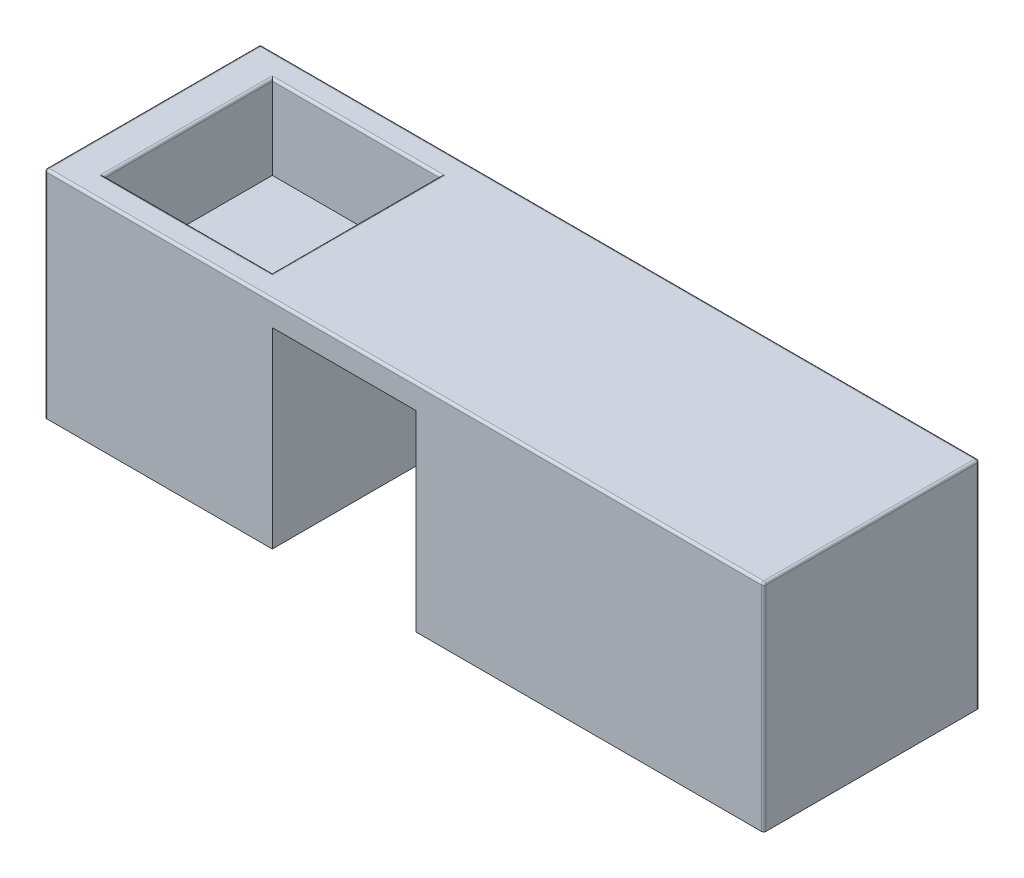
ISO-10303-21;
HEADER;
FILE_DESCRIPTION(('STEP AP214'),'2;1');
FILE_NAME('part.step','',(''),(''),'','','');
FILE_SCHEMA(('AUTOMOTIVE_DESIGN { 1 0 10303 214 1 1 1 1 }'));
ENDSEC;
DATA;
#1=APPLICATION_CONTEXT('core data for automotive mechanical design processes');
#2=APPLICATION_PROTOCOL_DEFINITION('international standard','automotive_design',2000,#1);
#3=PRODUCT_CONTEXT('',#1,'mechanical');
#4=PRODUCT('Part','Part','',(#3));
#5=PRODUCT_RELATED_PRODUCT_CATEGORY('part','',(#4));
#6=PRODUCT_DEFINITION_FORMATION('','',#4);
#7=PRODUCT_DEFINITION_CONTEXT('part definition',#1,'design');
#8=PRODUCT_DEFINITION('design','',#6,#7);
#9=PRODUCT_DEFINITION_SHAPE('','',#8);
#10=(LENGTH_UNIT() NAMED_UNIT(*) SI_UNIT(.MILLI.,.METRE.));
#11=(NAMED_UNIT(*) PLANE_ANGLE_UNIT() SI_UNIT($,.RADIAN.));
#12=(NAMED_UNIT(*) SI_UNIT($,.STERADIAN.) SOLID_ANGLE_UNIT());
#13=UNCERTAINTY_MEASURE_WITH_UNIT(LENGTH_MEASURE(1.E-05),#10,'distance_accuracy_value','');
#14=(GEOMETRIC_REPRESENTATION_CONTEXT(3) GLOBAL_UNCERTAINTY_ASSIGNED_CONTEXT((#13)) GLOBAL_UNIT_ASSIGNED_CONTEXT((#10,
#11,#12)) REPRESENTATION_CONTEXT('',''));
#15=CARTESIAN_POINT('',(0.,0.,0.));
#16=DIRECTION('',(0.,0.,1.));
#17=DIRECTION('',(1.,0.,0.));
#18=AXIS2_PLACEMENT_3D('',#15,#16,#17);
#19=CARTESIAN_POINT('',(-1500.,900.,450.));
#20=DIRECTION('',(0.,0.,-1.));
#21=DIRECTION('',(-1.,0.,0.));
#22=AXIS2_PLACEMENT_3D('',#19,#20,#21);
#23=PLANE('',#22);
#24=DIRECTION('',(1.,0.,0.));
#25=VECTOR('',#24,1.);
#26=CARTESIAN_POINT('',(-1500.,0.,450.));
#27=LINE('',#26,#25);
#28=CARTESIAN_POINT('',(50.0000000000007,0.,450.));
#29=VERTEX_POINT('',#28);
#30=CARTESIAN_POINT('',(1490.,0.,450.));
#31=VERTEX_POINT('',#30);
#32=EDGE_CURVE('E254',#29,#31,#27,.T.);
#33=ORIENTED_EDGE('',*,*,#32,.T.);
#34=DIRECTION('',(0.,-1.,0.));
#35=VECTOR('',#34,1.);
#36=CARTESIAN_POINT('',(1490.,900.,450.));
#37=LINE('',#36,#35);
#38=CARTESIAN_POINT('',(1490.,890.,450.));
#39=VERTEX_POINT('',#38);
#40=EDGE_CURVE('E340',#31,#39,#37,.F.);
#41=ORIENTED_EDGE('',*,*,#40,.T.);
#42=DIRECTION('',(1.,0.,0.));
#43=VECTOR('',#42,1.);
#44=CARTESIAN_POINT('',(-1500.,890.,450.));
#45=LINE('',#44,#43);
#46=CARTESIAN_POINT('',(-1490.,890.,450.));
#47=VERTEX_POINT('',#46);
#48=EDGE_CURVE('E278',#39,#47,#45,.F.);
#49=ORIENTED_EDGE('',*,*,#48,.T.);
#50=DIRECTION('',(0.,-1.,0.));
#51=VECTOR('',#50,1.);
#52=CARTESIAN_POINT('',(-1490.,900.,450.));
#53=LINE('',#52,#51);
#54=CARTESIAN_POINT('',(-1490.,0.,450.));
#55=VERTEX_POINT('',#54);
#56=EDGE_CURVE('E338',#47,#55,#53,.T.);
#57=ORIENTED_EDGE('',*,*,#56,.T.);
#58=CARTESIAN_POINT('',(-550.,0.,450.));
#59=VERTEX_POINT('',#58);
#60=EDGE_CURVE('E255',#55,#59,#27,.T.);
#61=ORIENTED_EDGE('',*,*,#60,.T.);
#62=DIRECTION('',(0.,-1.,0.));
#63=VECTOR('',#62,1.);
#64=CARTESIAN_POINT('',(-550.,800.,450.));
#65=LINE('',#64,#63);
#66=CARTESIAN_POINT('',(-550.,800.,450.));
#67=VERTEX_POINT('',#66);
#68=EDGE_CURVE('E223',#67,#59,#65,.T.);
#69=ORIENTED_EDGE('',*,*,#68,.F.);
#70=DIRECTION('',(-1.,0.,0.));
#71=VECTOR('',#70,1.);
#72=CARTESIAN_POINT('',(50.0000000000006,800.,450.));
#73=LINE('',#72,#71);
#74=CARTESIAN_POINT('',(50.0000000000007,800.,450.));
#75=VERTEX_POINT('',#74);
#76=EDGE_CURVE('E229',#75,#67,#73,.T.);
#77=ORIENTED_EDGE('',*,*,#76,.F.);
#78=DIRECTION('',(0.,1.,0.));
#79=VECTOR('',#78,1.);
#80=CARTESIAN_POINT('',(50.0000000000006,800.,450.));
#81=LINE('',#80,#79);
#82=EDGE_CURVE('E226',#29,#75,#81,.T.);
#83=ORIENTED_EDGE('',*,*,#82,.F.);
#84=EDGE_LOOP('',(#33,#41,#49,#57,#61,#69,#77,#83));
#85=FACE_BOUND('',#84,.T.);
#86=ADVANCED_FACE('F35',(#85),#23,.F.);
#87=CARTESIAN_POINT('',(0.,0.,0.));
#88=DIRECTION('',(0.,-1.,0.));
#89=DIRECTION('',(0.,0.,-1.));
#90=AXIS2_PLACEMENT_3D('',#87,#88,#89);
#91=PLANE('',#90);
#92=DIRECTION('',(-1.,0.,0.));
#93=VECTOR('',#92,1.);
#94=CARTESIAN_POINT('',(-1500.,0.,-450.));
#95=LINE('',#94,#93);
#96=CARTESIAN_POINT('',(1490.,0.,-450.));
#97=VERTEX_POINT('',#96);
#98=CARTESIAN_POINT('',(-1490.,0.,-450.));
#99=VERTEX_POINT('',#98);
#100=EDGE_CURVE('E248',#97,#99,#95,.T.);
#101=ORIENTED_EDGE('',*,*,#100,.F.);
#102=CARTESIAN_POINT('',(1490.,0.,-440.));
#103=DIRECTION('',(0.,-1.,0.));
#104=DIRECTION('',(0.,0.,-1.));
#105=AXIS2_PLACEMENT_3D('',#102,#103,#104);
#106=CIRCLE('',#105,10.);
#107=CARTESIAN_POINT('',(1500.,0.,-440.));
#108=VERTEX_POINT('',#107);
#109=EDGE_CURVE('E52',#97,#108,#106,.T.);
#110=ORIENTED_EDGE('',*,*,#109,.T.);
#111=DIRECTION('',(0.,0.,-1.));
#112=VECTOR('',#111,1.);
#113=CARTESIAN_POINT('',(1500.,0.,450.));
#114=LINE('',#113,#112);
#115=CARTESIAN_POINT('',(1500.,0.,440.));
#116=VERTEX_POINT('',#115);
#117=EDGE_CURVE('E244',#116,#108,#114,.T.);
#118=ORIENTED_EDGE('',*,*,#117,.F.);
#119=CARTESIAN_POINT('',(1490.,0.,440.));
#120=DIRECTION('',(0.,-1.,0.));
#121=DIRECTION('',(0.,0.,-1.));
#122=AXIS2_PLACEMENT_3D('',#119,#120,#121);
#123=CIRCLE('',#122,10.);
#124=EDGE_CURVE('E332',#116,#31,#123,.T.);
#125=ORIENTED_EDGE('',*,*,#124,.T.);
#126=ORIENTED_EDGE('',*,*,#32,.F.);
#127=DIRECTION('',(0.,0.,-1.));
#128=VECTOR('',#127,1.);
#129=CARTESIAN_POINT('',(50.0000000000006,0.,5648.54268420008));
#130=LINE('',#129,#128);
#131=CARTESIAN_POINT('',(50.0000000000007,0.,-350.));
#132=VERTEX_POINT('',#131);
#133=EDGE_CURVE('E239',#29,#132,#130,.T.);
#134=ORIENTED_EDGE('',*,*,#133,.T.);
#135=DIRECTION('',(1.,0.,0.));
#136=VECTOR('',#135,1.);
#137=CARTESIAN_POINT('',(-1500.,0.,-350.));
#138=LINE('',#137,#136);
#139=CARTESIAN_POINT('',(-550.,0.,-350.));
#140=VERTEX_POINT('',#139);
#141=EDGE_CURVE('E210',#140,#132,#138,.T.);
#142=ORIENTED_EDGE('',*,*,#141,.F.);
#143=DIRECTION('',(0.,0.,-1.));
#144=VECTOR('',#143,1.);
#145=CARTESIAN_POINT('',(-550.,0.,5648.54268420008));
#146=LINE('',#145,#144);
#147=EDGE_CURVE('E218',#59,#140,#146,.T.);
#148=ORIENTED_EDGE('',*,*,#147,.F.);
#149=ORIENTED_EDGE('',*,*,#60,.F.);
#150=CARTESIAN_POINT('',(-1490.,0.,440.));
#151=DIRECTION('',(0.,-1.,0.));
#152=DIRECTION('',(0.,0.,-1.));
#153=AXIS2_PLACEMENT_3D('',#150,#151,#152);
#154=CIRCLE('',#153,10.);
#155=CARTESIAN_POINT('',(-1500.,0.,440.));
#156=VERTEX_POINT('',#155);
#157=EDGE_CURVE('E328',#55,#156,#154,.T.);
#158=ORIENTED_EDGE('',*,*,#157,.T.);
#159=DIRECTION('',(0.,0.,1.));
#160=VECTOR('',#159,1.);
#161=CARTESIAN_POINT('',(-1500.,0.,450.));
#162=LINE('',#161,#160);
#163=CARTESIAN_POINT('',(-1500.,0.,-440.));
#164=VERTEX_POINT('',#163);
#165=EDGE_CURVE('E251',#164,#156,#162,.T.);
#166=ORIENTED_EDGE('',*,*,#165,.F.);
#167=CARTESIAN_POINT('',(-1490.,0.,-440.));
#168=DIRECTION('',(0.,-1.,0.));
#169=DIRECTION('',(0.,0.,-1.));
#170=AXIS2_PLACEMENT_3D('',#167,#168,#169);
#171=CIRCLE('',#170,10.);
#172=EDGE_CURVE('E330',#164,#99,#171,.T.);
#173=ORIENTED_EDGE('',*,*,#172,.T.);
#174=EDGE_LOOP('',(#101,#110,#118,#125,#126,#134,#142,#148,#149,#158,#166,#173));
#175=FACE_BOUND('',#174,.T.);
#176=ADVANCED_FACE('F401',(#175),#91,.T.);
#177=CARTESIAN_POINT('',(1500.,900.,450.));
#178=DIRECTION('',(-1.,0.,0.));
#179=DIRECTION('',(0.,0.,1.));
#180=AXIS2_PLACEMENT_3D('',#177,#178,#179);
#181=PLANE('',#180);
#182=ORIENTED_EDGE('',*,*,#117,.T.);
#183=DIRECTION('',(0.,-1.,0.));
#184=VECTOR('',#183,1.);
#185=CARTESIAN_POINT('',(1500.,900.,-440.));
#186=LINE('',#185,#184);
#187=CARTESIAN_POINT('',(1500.,890.,-440.));
#188=VERTEX_POINT('',#187);
#189=EDGE_CURVE('E336',#108,#188,#186,.F.);
#190=ORIENTED_EDGE('',*,*,#189,.T.);
#191=DIRECTION('',(0.,0.,-1.));
#192=VECTOR('',#191,1.);
#193=CARTESIAN_POINT('',(1500.,890.,450.));
#194=LINE('',#193,#192);
#195=CARTESIAN_POINT('',(1500.,890.,440.));
#196=VERTEX_POINT('',#195);
#197=EDGE_CURVE('E287',#188,#196,#194,.F.);
#198=ORIENTED_EDGE('',*,*,#197,.T.);
#199=DIRECTION('',(0.,-1.,0.));
#200=VECTOR('',#199,1.);
#201=CARTESIAN_POINT('',(1500.,900.,440.));
#202=LINE('',#201,#200);
#203=EDGE_CURVE('E59',#196,#116,#202,.T.);
#204=ORIENTED_EDGE('',*,*,#203,.T.);
#205=EDGE_LOOP('',(#182,#190,#198,#204));
#206=FACE_BOUND('',#205,.T.);
#207=ADVANCED_FACE('F414',(#206),#181,.F.);
#208=CARTESIAN_POINT('',(-1500.,900.,-450.));
#209=DIRECTION('',(0.,0.,1.));
#210=DIRECTION('',(1.,0.,0.));
#211=AXIS2_PLACEMENT_3D('',#208,#209,#210);
#212=PLANE('',#211);
#213=DIRECTION('',(-1.,0.,0.));
#214=VECTOR('',#213,1.);
#215=CARTESIAN_POINT('',(-1500.,890.,-450.));
#216=LINE('',#215,#214);
#217=CARTESIAN_POINT('',(-1490.,890.,-450.));
#218=VERTEX_POINT('',#217);
#219=CARTESIAN_POINT('',(1490.,890.,-450.));
#220=VERTEX_POINT('',#219);
#221=EDGE_CURVE('E284',#218,#220,#216,.F.);
#222=ORIENTED_EDGE('',*,*,#221,.T.);
#223=DIRECTION('',(0.,-1.,0.));
#224=VECTOR('',#223,1.);
#225=CARTESIAN_POINT('',(1490.,900.,-450.));
#226=LINE('',#225,#224);
#227=EDGE_CURVE('E326',#220,#97,#226,.T.);
#228=ORIENTED_EDGE('',*,*,#227,.T.);
#229=ORIENTED_EDGE('',*,*,#100,.T.);
#230=DIRECTION('',(0.,-1.,0.));
#231=VECTOR('',#230,1.);
#232=CARTESIAN_POINT('',(-1490.,900.,-450.));
#233=LINE('',#232,#231);
#234=EDGE_CURVE('E324',#99,#218,#233,.F.);
#235=ORIENTED_EDGE('',*,*,#234,.T.);
#236=EDGE_LOOP('',(#222,#228,#229,#235));
#237=FACE_BOUND('',#236,.T.);
#238=ADVANCED_FACE('F423',(#237),#212,.F.);
#239=CARTESIAN_POINT('',(-1500.,900.,450.));
#240=DIRECTION('',(1.,0.,0.));
#241=DIRECTION('',(0.,0.,-1.));
#242=AXIS2_PLACEMENT_3D('',#239,#240,#241);
#243=PLANE('',#242);
#244=DIRECTION('',(0.,0.,1.));
#245=VECTOR('',#244,1.);
#246=CARTESIAN_POINT('',(-1500.,890.,450.));
#247=LINE('',#246,#245);
#248=CARTESIAN_POINT('',(-1500.,890.,440.));
#249=VERTEX_POINT('',#248);
#250=CARTESIAN_POINT('',(-1500.,890.,-440.));
#251=VERTEX_POINT('',#250);
#252=EDGE_CURVE('E281',#249,#251,#247,.F.);
#253=ORIENTED_EDGE('',*,*,#252,.T.);
#254=DIRECTION('',(0.,-1.,0.));
#255=VECTOR('',#254,1.);
#256=CARTESIAN_POINT('',(-1500.,900.,-440.));
#257=LINE('',#256,#255);
#258=EDGE_CURVE('E11',#251,#164,#257,.T.);
#259=ORIENTED_EDGE('',*,*,#258,.T.);
#260=ORIENTED_EDGE('',*,*,#165,.T.);
#261=DIRECTION('',(0.,-1.,0.));
#262=VECTOR('',#261,1.);
#263=CARTESIAN_POINT('',(-1500.,900.,440.));
#264=LINE('',#263,#262);
#265=EDGE_CURVE('E44',#156,#249,#264,.F.);
#266=ORIENTED_EDGE('',*,*,#265,.T.);
#267=EDGE_LOOP('',(#253,#259,#260,#266));
#268=FACE_BOUND('',#267,.T.);
#269=ADVANCED_FACE('F400',(#268),#243,.F.);
#270=CARTESIAN_POINT('',(0.,900.,0.));
#271=DIRECTION('',(0.,-1.,0.));
#272=DIRECTION('',(0.,0.,-1.));
#273=AXIS2_PLACEMENT_3D('',#270,#271,#272);
#274=PLANE('',#273);
#275=DIRECTION('',(0.,0.,1.));
#276=VECTOR('',#275,1.);
#277=CARTESIAN_POINT('',(-1490.,900.,0.));
#278=LINE('',#277,#276);
#279=CARTESIAN_POINT('',(-1490.,900.,-440.));
#280=VERTEX_POINT('',#279);
#281=CARTESIAN_POINT('',(-1490.,900.,440.));
#282=VERTEX_POINT('',#281);
#283=EDGE_CURVE('E272',#280,#282,#278,.T.);
#284=ORIENTED_EDGE('',*,*,#283,.T.);
#285=DIRECTION('',(1.,0.,0.));
#286=VECTOR('',#285,1.);
#287=CARTESIAN_POINT('',(0.,900.,440.));
#288=LINE('',#287,#286);
#289=CARTESIAN_POINT('',(1490.,900.,440.));
#290=VERTEX_POINT('',#289);
#291=EDGE_CURVE('E275',#282,#290,#288,.T.);
#292=ORIENTED_EDGE('',*,*,#291,.T.);
#293=DIRECTION('',(0.,0.,-1.));
#294=VECTOR('',#293,1.);
#295=CARTESIAN_POINT('',(1490.,900.,0.));
#296=LINE('',#295,#294);
#297=CARTESIAN_POINT('',(1490.,900.,-440.));
#298=VERTEX_POINT('',#297);
#299=EDGE_CURVE('E266',#290,#298,#296,.T.);
#300=ORIENTED_EDGE('',*,*,#299,.T.);
#301=DIRECTION('',(-1.,0.,0.));
#302=VECTOR('',#301,1.);
#303=CARTESIAN_POINT('',(0.,900.,-440.));
#304=LINE('',#303,#302);
#305=EDGE_CURVE('E269',#298,#280,#304,.T.);
#306=ORIENTED_EDGE('',*,*,#305,.T.);
#307=EDGE_LOOP('',(#284,#292,#300,#306));
#308=FACE_BOUND('',#307,.T.);
#309=DIRECTION('',(-1.,0.,0.));
#310=VECTOR('',#309,1.);
#311=CARTESIAN_POINT('',(0.,900.,-360.));
#312=LINE('',#311,#310);
#313=CARTESIAN_POINT('',(-1360.,900.,-360.));
#314=VERTEX_POINT('',#313);
#315=CARTESIAN_POINT('',(-640.,900.,-360.));
#316=VERTEX_POINT('',#315);
#317=EDGE_CURVE('E261',#314,#316,#312,.F.);
#318=ORIENTED_EDGE('',*,*,#317,.T.);
#319=DIRECTION('',(0.,0.,-1.));
#320=VECTOR('',#319,1.);
#321=CARTESIAN_POINT('',(-640.,900.,0.));
#322=LINE('',#321,#320);
#323=CARTESIAN_POINT('',(-640.,900.,360.));
#324=VERTEX_POINT('',#323);
#325=EDGE_CURVE('E263',#316,#324,#322,.F.);
#326=ORIENTED_EDGE('',*,*,#325,.T.);
#327=DIRECTION('',(1.,0.,0.));
#328=VECTOR('',#327,1.);
#329=CARTESIAN_POINT('',(0.,900.,360.));
#330=LINE('',#329,#328);
#331=CARTESIAN_POINT('',(-1360.,900.,360.));
#332=VERTEX_POINT('',#331);
#333=EDGE_CURVE('E257',#324,#332,#330,.F.);
#334=ORIENTED_EDGE('',*,*,#333,.T.);
#335=DIRECTION('',(0.,0.,1.));
#336=VECTOR('',#335,1.);
#337=CARTESIAN_POINT('',(-1360.,900.,0.));
#338=LINE('',#337,#336);
#339=EDGE_CURVE('E259',#332,#314,#338,.F.);
#340=ORIENTED_EDGE('',*,*,#339,.T.);
#341=EDGE_LOOP('',(#318,#326,#334,#340));
#342=FACE_BOUND('',#341,.T.);
#343=ADVANCED_FACE('F385',(#308,#342),#274,.F.);
#344=CARTESIAN_POINT('',(50.0000000000006,800.,5648.54268420008));
#345=DIRECTION('',(1.,0.,0.));
#346=DIRECTION('',(0.,0.,-1.));
#347=AXIS2_PLACEMENT_3D('',#344,#345,#346);
#348=PLANE('',#347);
#349=ORIENTED_EDGE('',*,*,#82,.T.);
#350=DIRECTION('',(0.,0.,-1.));
#351=VECTOR('',#350,1.);
#352=CARTESIAN_POINT('',(50.0000000000006,800.,5648.54268420008));
#353=LINE('',#352,#351);
#354=CARTESIAN_POINT('',(50.0000000000007,800.,-350.));
#355=VERTEX_POINT('',#354);
#356=EDGE_CURVE('E241',#75,#355,#353,.T.);
#357=ORIENTED_EDGE('',*,*,#356,.T.);
#358=DIRECTION('',(0.,1.,0.));
#359=VECTOR('',#358,1.);
#360=CARTESIAN_POINT('',(50.0000000000006,800.,-350.));
#361=LINE('',#360,#359);
#362=EDGE_CURVE('E215',#132,#355,#361,.T.);
#363=ORIENTED_EDGE('',*,*,#362,.F.);
#364=ORIENTED_EDGE('',*,*,#133,.F.);
#365=EDGE_LOOP('',(#349,#357,#363,#364));
#366=FACE_BOUND('',#365,.T.);
#367=ADVANCED_FACE('F412',(#366),#348,.F.);
#368=CARTESIAN_POINT('',(50.0000000000006,800.,5648.54268420008));
#369=DIRECTION('',(0.,1.,0.));
#370=DIRECTION('',(0.,0.,1.));
#371=AXIS2_PLACEMENT_3D('',#368,#369,#370);
#372=PLANE('',#371);
#373=ORIENTED_EDGE('',*,*,#76,.T.);
#374=DIRECTION('',(0.,0.,-1.));
#375=VECTOR('',#374,1.);
#376=CARTESIAN_POINT('',(-550.,800.,5648.54268420008));
#377=LINE('',#376,#375);
#378=CARTESIAN_POINT('',(-550.,800.,-350.));
#379=VERTEX_POINT('',#378);
#380=EDGE_CURVE('E236',#67,#379,#377,.T.);
#381=ORIENTED_EDGE('',*,*,#380,.T.);
#382=DIRECTION('',(-1.,0.,0.));
#383=VECTOR('',#382,1.);
#384=CARTESIAN_POINT('',(50.0000000000006,800.,-350.));
#385=LINE('',#384,#383);
#386=EDGE_CURVE('E219',#355,#379,#385,.T.);
#387=ORIENTED_EDGE('',*,*,#386,.F.);
#388=ORIENTED_EDGE('',*,*,#356,.F.);
#389=EDGE_LOOP('',(#373,#381,#387,#388));
#390=FACE_BOUND('',#389,.T.);
#391=ADVANCED_FACE('F408',(#390),#372,.F.);
#392=CARTESIAN_POINT('',(-550.,800.,5648.54268420008));
#393=DIRECTION('',(-1.,0.,0.));
#394=DIRECTION('',(0.,0.,1.));
#395=AXIS2_PLACEMENT_3D('',#392,#393,#394);
#396=PLANE('',#395);
#397=ORIENTED_EDGE('',*,*,#68,.T.);
#398=ORIENTED_EDGE('',*,*,#147,.T.);
#399=DIRECTION('',(0.,-1.,0.));
#400=VECTOR('',#399,1.);
#401=CARTESIAN_POINT('',(-550.,800.,-350.));
#402=LINE('',#401,#400);
#403=EDGE_CURVE('E220',#379,#140,#402,.T.);
#404=ORIENTED_EDGE('',*,*,#403,.F.);
#405=ORIENTED_EDGE('',*,*,#380,.F.);
#406=EDGE_LOOP('',(#397,#398,#404,#405));
#407=FACE_BOUND('',#406,.T.);
#408=ADVANCED_FACE('F406',(#407),#396,.F.);
#409=CARTESIAN_POINT('',(-1500.,900.,-350.));
#410=DIRECTION('',(0.,0.,-1.));
#411=DIRECTION('',(-1.,0.,0.));
#412=AXIS2_PLACEMENT_3D('',#409,#410,#411);
#413=PLANE('',#412);
#414=ORIENTED_EDGE('',*,*,#403,.T.);
#415=ORIENTED_EDGE('',*,*,#141,.T.);
#416=ORIENTED_EDGE('',*,*,#362,.T.);
#417=ORIENTED_EDGE('',*,*,#386,.T.);
#418=EDGE_LOOP('',(#414,#415,#416,#417));
#419=FACE_BOUND('',#418,.T.);
#420=ADVANCED_FACE('F441',(#419),#413,.F.);
#421=CARTESIAN_POINT('',(-1350.,550.,350.));
#422=DIRECTION('',(-1.,0.,0.));
#423=DIRECTION('',(0.,0.,1.));
#424=AXIS2_PLACEMENT_3D('',#421,#422,#423);
#425=PLANE('',#424);
#426=DIRECTION('',(0.,1.,0.));
#427=VECTOR('',#426,1.);
#428=CARTESIAN_POINT('',(-1350.,550.,-350.));
#429=LINE('',#428,#427);
#430=CARTESIAN_POINT('',(-1350.,550.,-350.));
#431=VERTEX_POINT('',#430);
#432=CARTESIAN_POINT('',(-1350.,890.,-350.));
#433=VERTEX_POINT('',#432);
#434=EDGE_CURVE('E208',#431,#433,#429,.T.);
#435=ORIENTED_EDGE('',*,*,#434,.T.);
#436=DIRECTION('',(0.,0.,1.));
#437=VECTOR('',#436,1.);
#438=CARTESIAN_POINT('',(-1350.,890.,350.));
#439=LINE('',#438,#437);
#440=CARTESIAN_POINT('',(-1350.,890.,350.));
#441=VERTEX_POINT('',#440);
#442=EDGE_CURVE('E183',#433,#441,#439,.T.);
#443=ORIENTED_EDGE('',*,*,#442,.T.);
#444=DIRECTION('',(0.,1.,0.));
#445=VECTOR('',#444,1.);
#446=CARTESIAN_POINT('',(-1350.,550.,350.));
#447=LINE('',#446,#445);
#448=CARTESIAN_POINT('',(-1350.,550.,350.));
#449=VERTEX_POINT('',#448);
#450=EDGE_CURVE('E175',#449,#441,#447,.T.);
#451=ORIENTED_EDGE('',*,*,#450,.F.);
#452=DIRECTION('',(0.,0.,1.));
#453=VECTOR('',#452,1.);
#454=CARTESIAN_POINT('',(-1350.,550.,350.));
#455=LINE('',#454,#453);
#456=EDGE_CURVE('E180',#431,#449,#455,.T.);
#457=ORIENTED_EDGE('',*,*,#456,.F.);
#458=EDGE_LOOP('',(#435,#443,#451,#457));
#459=FACE_BOUND('',#458,.T.);
#460=ADVANCED_FACE('F178',(#459),#425,.F.);
#461=CARTESIAN_POINT('',(-650.,550.,-350.));
#462=DIRECTION('',(0.,0.,-1.));
#463=DIRECTION('',(-1.,0.,0.));
#464=AXIS2_PLACEMENT_3D('',#461,#462,#463);
#465=PLANE('',#464);
#466=DIRECTION('',(0.,1.,0.));
#467=VECTOR('',#466,1.);
#468=CARTESIAN_POINT('',(-650.,550.,-350.));
#469=LINE('',#468,#467);
#470=CARTESIAN_POINT('',(-650.,550.,-350.));
#471=VERTEX_POINT('',#470);
#472=CARTESIAN_POINT('',(-650.,890.,-350.));
#473=VERTEX_POINT('',#472);
#474=EDGE_CURVE('E211',#471,#473,#469,.T.);
#475=ORIENTED_EDGE('',*,*,#474,.T.);
#476=DIRECTION('',(-1.,0.,0.));
#477=VECTOR('',#476,1.);
#478=CARTESIAN_POINT('',(-650.,890.,-350.));
#479=LINE('',#478,#477);
#480=EDGE_CURVE('E292',#473,#433,#479,.T.);
#481=ORIENTED_EDGE('',*,*,#480,.T.);
#482=ORIENTED_EDGE('',*,*,#434,.F.);
#483=DIRECTION('',(-1.,0.,0.));
#484=VECTOR('',#483,1.);
#485=CARTESIAN_POINT('',(-650.,550.,-350.));
#486=LINE('',#485,#484);
#487=EDGE_CURVE('E187',#471,#431,#486,.T.);
#488=ORIENTED_EDGE('',*,*,#487,.F.);
#489=EDGE_LOOP('',(#475,#481,#482,#488));
#490=FACE_BOUND('',#489,.T.);
#491=ADVANCED_FACE('F453',(#490),#465,.F.);
#492=CARTESIAN_POINT('',(-650.,550.,350.));
#493=DIRECTION('',(1.,0.,0.));
#494=DIRECTION('',(0.,0.,-1.));
#495=AXIS2_PLACEMENT_3D('',#492,#493,#494);
#496=PLANE('',#495);
#497=DIRECTION('',(0.,1.,0.));
#498=VECTOR('',#497,1.);
#499=CARTESIAN_POINT('',(-650.,550.,350.));
#500=LINE('',#499,#498);
#501=CARTESIAN_POINT('',(-650.,550.,350.));
#502=VERTEX_POINT('',#501);
#503=CARTESIAN_POINT('',(-650.,890.,350.));
#504=VERTEX_POINT('',#503);
#505=EDGE_CURVE('E186',#502,#504,#500,.T.);
#506=ORIENTED_EDGE('',*,*,#505,.T.);
#507=DIRECTION('',(0.,0.,-1.));
#508=VECTOR('',#507,1.);
#509=CARTESIAN_POINT('',(-650.,890.,350.));
#510=LINE('',#509,#508);
#511=EDGE_CURVE('E289',#504,#473,#510,.T.);
#512=ORIENTED_EDGE('',*,*,#511,.T.);
#513=ORIENTED_EDGE('',*,*,#474,.F.);
#514=DIRECTION('',(0.,0.,-1.));
#515=VECTOR('',#514,1.);
#516=CARTESIAN_POINT('',(-650.,550.,350.));
#517=LINE('',#516,#515);
#518=EDGE_CURVE('E196',#502,#471,#517,.T.);
#519=ORIENTED_EDGE('',*,*,#518,.F.);
#520=EDGE_LOOP('',(#506,#512,#513,#519));
#521=FACE_BOUND('',#520,.T.);
#522=ADVANCED_FACE('F456',(#521),#496,.F.);
#523=CARTESIAN_POINT('',(-650.,550.,350.));
#524=DIRECTION('',(0.,0.,1.));
#525=DIRECTION('',(1.,0.,0.));
#526=AXIS2_PLACEMENT_3D('',#523,#524,#525);
#527=PLANE('',#526);
#528=ORIENTED_EDGE('',*,*,#450,.T.);
#529=DIRECTION('',(1.,0.,0.));
#530=VECTOR('',#529,1.);
#531=CARTESIAN_POINT('',(-650.,890.,350.));
#532=LINE('',#531,#530);
#533=EDGE_CURVE('E295',#441,#504,#532,.T.);
#534=ORIENTED_EDGE('',*,*,#533,.T.);
#535=ORIENTED_EDGE('',*,*,#505,.F.);
#536=DIRECTION('',(1.,0.,0.));
#537=VECTOR('',#536,1.);
#538=CARTESIAN_POINT('',(-650.,550.,350.));
#539=LINE('',#538,#537);
#540=EDGE_CURVE('E190',#449,#502,#539,.T.);
#541=ORIENTED_EDGE('',*,*,#540,.F.);
#542=EDGE_LOOP('',(#528,#534,#535,#541));
#543=FACE_BOUND('',#542,.T.);
#544=ADVANCED_FACE('F191',(#543),#527,.F.);
#545=CARTESIAN_POINT('',(0.,550.,0.));
#546=DIRECTION('',(0.,1.,0.));
#547=DIRECTION('',(0.,0.,1.));
#548=AXIS2_PLACEMENT_3D('',#545,#546,#547);
#549=PLANE('',#548);
#550=ORIENTED_EDGE('',*,*,#456,.T.);
#551=ORIENTED_EDGE('',*,*,#540,.T.);
#552=ORIENTED_EDGE('',*,*,#518,.T.);
#553=ORIENTED_EDGE('',*,*,#487,.T.);
#554=EDGE_LOOP('',(#550,#551,#552,#553));
#555=FACE_BOUND('',#554,.T.);
#556=ADVANCED_FACE('F198',(#555),#549,.T.);
#557=CARTESIAN_POINT('',(0.,890.,-440.));
#558=DIRECTION('',(-1.,0.,0.));
#559=DIRECTION('',(0.,0.,1.));
#560=AXIS2_PLACEMENT_3D('',#557,#558,#559);
#561=CYLINDRICAL_SURFACE('',#560,10.);
#562=ORIENTED_EDGE('',*,*,#305,.F.);
#563=CARTESIAN_POINT('',(1490.,890.,-440.));
#564=DIRECTION('',(-1.,0.,0.));
#565=DIRECTION('',(0.,0.,1.));
#566=AXIS2_PLACEMENT_3D('',#563,#564,#565);
#567=CIRCLE('',#566,10.);
#568=EDGE_CURVE('E311',#298,#220,#567,.T.);
#569=ORIENTED_EDGE('',*,*,#568,.T.);
#570=ORIENTED_EDGE('',*,*,#221,.F.);
#571=CARTESIAN_POINT('',(-1490.,890.,-440.));
#572=DIRECTION('',(-1.,0.,0.));
#573=DIRECTION('',(0.,0.,1.));
#574=AXIS2_PLACEMENT_3D('',#571,#572,#573);
#575=CIRCLE('',#574,10.);
#576=EDGE_CURVE('E309',#218,#280,#575,.F.);
#577=ORIENTED_EDGE('',*,*,#576,.T.);
#578=EDGE_LOOP('',(#562,#569,#570,#577));
#579=FACE_BOUND('',#578,.T.);
#580=ADVANCED_FACE('F421',(#579),#561,.T.);
#581=CARTESIAN_POINT('',(-1490.,890.,0.));
#582=DIRECTION('',(0.,0.,1.));
#583=DIRECTION('',(1.,0.,0.));
#584=AXIS2_PLACEMENT_3D('',#581,#582,#583);
#585=CYLINDRICAL_SURFACE('',#584,10.);
#586=ORIENTED_EDGE('',*,*,#283,.F.);
#587=CARTESIAN_POINT('',(-1490.,890.,-440.));
#588=DIRECTION('',(0.,0.,1.));
#589=DIRECTION('',(1.,0.,0.));
#590=AXIS2_PLACEMENT_3D('',#587,#588,#589);
#591=CIRCLE('',#590,10.);
#592=EDGE_CURVE('E321',#280,#251,#591,.T.);
#593=ORIENTED_EDGE('',*,*,#592,.T.);
#594=ORIENTED_EDGE('',*,*,#252,.F.);
#595=CARTESIAN_POINT('',(-1490.,890.,440.));
#596=DIRECTION('',(0.,0.,1.));
#597=DIRECTION('',(1.,0.,0.));
#598=AXIS2_PLACEMENT_3D('',#595,#596,#597);
#599=CIRCLE('',#598,10.);
#600=EDGE_CURVE('E319',#249,#282,#599,.F.);
#601=ORIENTED_EDGE('',*,*,#600,.T.);
#602=EDGE_LOOP('',(#586,#593,#594,#601));
#603=FACE_BOUND('',#602,.T.);
#604=ADVANCED_FACE('F389',(#603),#585,.T.);
#605=CARTESIAN_POINT('',(1490.,890.,0.));
#606=DIRECTION('',(0.,0.,-1.));
#607=DIRECTION('',(-1.,0.,0.));
#608=AXIS2_PLACEMENT_3D('',#605,#606,#607);
#609=CYLINDRICAL_SURFACE('',#608,10.);
#610=ORIENTED_EDGE('',*,*,#197,.F.);
#611=CARTESIAN_POINT('',(1490.,890.,-440.));
#612=DIRECTION('',(0.,0.,-1.));
#613=DIRECTION('',(-1.,0.,0.));
#614=AXIS2_PLACEMENT_3D('',#611,#612,#613);
#615=CIRCLE('',#614,10.);
#616=EDGE_CURVE('E306',#188,#298,#615,.F.);
#617=ORIENTED_EDGE('',*,*,#616,.T.);
#618=ORIENTED_EDGE('',*,*,#299,.F.);
#619=CARTESIAN_POINT('',(1490.,890.,440.));
#620=DIRECTION('',(0.,0.,-1.));
#621=DIRECTION('',(-1.,0.,0.));
#622=AXIS2_PLACEMENT_3D('',#619,#620,#621);
#623=CIRCLE('',#622,10.);
#624=EDGE_CURVE('E297',#290,#196,#623,.T.);
#625=ORIENTED_EDGE('',*,*,#624,.T.);
#626=EDGE_LOOP('',(#610,#617,#618,#625));
#627=FACE_BOUND('',#626,.T.);
#628=ADVANCED_FACE('F381',(#627),#609,.T.);
#629=CARTESIAN_POINT('',(0.,890.,440.));
#630=DIRECTION('',(1.,0.,0.));
#631=DIRECTION('',(0.,0.,-1.));
#632=AXIS2_PLACEMENT_3D('',#629,#630,#631);
#633=CYLINDRICAL_SURFACE('',#632,10.);
#634=ORIENTED_EDGE('',*,*,#48,.F.);
#635=CARTESIAN_POINT('',(1490.,890.,440.));
#636=DIRECTION('',(1.,0.,0.));
#637=DIRECTION('',(0.,0.,-1.));
#638=AXIS2_PLACEMENT_3D('',#635,#636,#637);
#639=CIRCLE('',#638,10.);
#640=EDGE_CURVE('E316',#39,#290,#639,.F.);
#641=ORIENTED_EDGE('',*,*,#640,.T.);
#642=ORIENTED_EDGE('',*,*,#291,.F.);
#643=CARTESIAN_POINT('',(-1490.,890.,440.));
#644=DIRECTION('',(1.,0.,0.));
#645=DIRECTION('',(0.,0.,-1.));
#646=AXIS2_PLACEMENT_3D('',#643,#644,#645);
#647=CIRCLE('',#646,10.);
#648=EDGE_CURVE('E313',#282,#47,#647,.T.);
#649=ORIENTED_EDGE('',*,*,#648,.T.);
#650=EDGE_LOOP('',(#634,#641,#642,#649));
#651=FACE_BOUND('',#650,.T.);
#652=ADVANCED_FACE('F367',(#651),#633,.T.);
#653=CARTESIAN_POINT('',(-1360.,890.,350.));
#654=DIRECTION('',(0.,0.,1.));
#655=DIRECTION('',(1.,0.,0.));
#656=AXIS2_PLACEMENT_3D('',#653,#654,#655);
#657=CYLINDRICAL_SURFACE('',#656,10.);
#658=CARTESIAN_POINT('',(-1360.,890.,-360.));
#659=DIRECTION('',(-0.707106781186547,0.,0.707106781186548));
#660=DIRECTION('',(-0.707106781186548,0.,-0.707106781186547));
#661=AXIS2_PLACEMENT_3D('',#658,#659,#660);
#662=ELLIPSE('',#661,14.1421356237309,10.);
#663=EDGE_CURVE('E203',#314,#433,#662,.F.);
#664=ORIENTED_EDGE('',*,*,#663,.F.);
#665=ORIENTED_EDGE('',*,*,#339,.F.);
#666=CARTESIAN_POINT('',(-1360.,890.,360.));
#667=DIRECTION('',(0.707106781186548,0.,0.707106781186547));
#668=DIRECTION('',(-0.707106781186547,0.,0.707106781186548));
#669=AXIS2_PLACEMENT_3D('',#666,#667,#668);
#670=ELLIPSE('',#669,14.142135623731,10.);
#671=EDGE_CURVE('E200',#441,#332,#670,.T.);
#672=ORIENTED_EDGE('',*,*,#671,.F.);
#673=ORIENTED_EDGE('',*,*,#442,.F.);
#674=EDGE_LOOP('',(#664,#665,#672,#673));
#675=FACE_BOUND('',#674,.T.);
#676=ADVANCED_FACE('F485',(#675),#657,.T.);
#677=CARTESIAN_POINT('',(-650.,890.,360.));
#678=DIRECTION('',(1.,0.,0.));
#679=DIRECTION('',(0.,0.,-1.));
#680=AXIS2_PLACEMENT_3D('',#677,#678,#679);
#681=CYLINDRICAL_SURFACE('',#680,10.);
#682=ORIENTED_EDGE('',*,*,#671,.T.);
#683=ORIENTED_EDGE('',*,*,#333,.F.);
#684=CARTESIAN_POINT('',(-640.,890.,360.));
#685=DIRECTION('',(0.707106781186547,0.,-0.707106781186548));
#686=DIRECTION('',(-0.707106781186548,0.,-0.707106781186547));
#687=AXIS2_PLACEMENT_3D('',#684,#685,#686);
#688=ELLIPSE('',#687,14.1421356237309,10.);
#689=EDGE_CURVE('E300',#504,#324,#688,.T.);
#690=ORIENTED_EDGE('',*,*,#689,.F.);
#691=ORIENTED_EDGE('',*,*,#533,.F.);
#692=EDGE_LOOP('',(#682,#683,#690,#691));
#693=FACE_BOUND('',#692,.T.);
#694=ADVANCED_FACE('F481',(#693),#681,.T.);
#695=CARTESIAN_POINT('',(-650.,890.,-360.));
#696=DIRECTION('',(-1.,0.,0.));
#697=DIRECTION('',(0.,0.,1.));
#698=AXIS2_PLACEMENT_3D('',#695,#696,#697);
#699=CYLINDRICAL_SURFACE('',#698,10.);
#700=ORIENTED_EDGE('',*,*,#663,.T.);
#701=ORIENTED_EDGE('',*,*,#480,.F.);
#702=CARTESIAN_POINT('',(-640.,890.,-360.));
#703=DIRECTION('',(-0.707106781186548,0.,-0.707106781186547));
#704=DIRECTION('',(0.707106781186547,0.,-0.707106781186548));
#705=AXIS2_PLACEMENT_3D('',#702,#703,#704);
#706=ELLIPSE('',#705,14.142135623731,10.);
#707=EDGE_CURVE('E298',#316,#473,#706,.F.);
#708=ORIENTED_EDGE('',*,*,#707,.F.);
#709=ORIENTED_EDGE('',*,*,#317,.F.);
#710=EDGE_LOOP('',(#700,#701,#708,#709));
#711=FACE_BOUND('',#710,.T.);
#712=ADVANCED_FACE('F477',(#711),#699,.T.);
#713=CARTESIAN_POINT('',(-640.,890.,350.));
#714=DIRECTION('',(0.,0.,-1.));
#715=DIRECTION('',(-1.,0.,0.));
#716=AXIS2_PLACEMENT_3D('',#713,#714,#715);
#717=CYLINDRICAL_SURFACE('',#716,10.);
#718=ORIENTED_EDGE('',*,*,#689,.T.);
#719=ORIENTED_EDGE('',*,*,#325,.F.);
#720=ORIENTED_EDGE('',*,*,#707,.T.);
#721=ORIENTED_EDGE('',*,*,#511,.F.);
#722=EDGE_LOOP('',(#718,#719,#720,#721));
#723=FACE_BOUND('',#722,.T.);
#724=ADVANCED_FACE('F474',(#723),#717,.T.);
#725=CARTESIAN_POINT('',(1490.,900.,-440.));
#726=DIRECTION('',(0.,-1.,0.));
#727=DIRECTION('',(0.,0.,-1.));
#728=AXIS2_PLACEMENT_3D('',#725,#726,#727);
#729=CYLINDRICAL_SURFACE('',#728,10.);
#730=ORIENTED_EDGE('',*,*,#109,.F.);
#731=ORIENTED_EDGE('',*,*,#227,.F.);
#732=CARTESIAN_POINT('',(1490.,890.,-440.));
#733=DIRECTION('',(0.,1.,0.));
#734=DIRECTION('',(0.,0.,1.));
#735=AXIS2_PLACEMENT_3D('',#732,#733,#734);
#736=CIRCLE('',#735,10.);
#737=EDGE_CURVE('E301',#188,#220,#736,.T.);
#738=ORIENTED_EDGE('',*,*,#737,.F.);
#739=ORIENTED_EDGE('',*,*,#189,.F.);
#740=EDGE_LOOP('',(#730,#731,#738,#739));
#741=FACE_BOUND('',#740,.T.);
#742=ADVANCED_FACE('F417',(#741),#729,.T.);
#743=CARTESIAN_POINT('',(1490.,890.,-440.));
#744=DIRECTION('',(0.,0.,1.));
#745=DIRECTION('',(1.,0.,0.));
#746=AXIS2_PLACEMENT_3D('',#743,#744,#745);
#747=SPHERICAL_SURFACE('',#746,10.);
#748=ORIENTED_EDGE('',*,*,#737,.T.);
#749=ORIENTED_EDGE('',*,*,#568,.F.);
#750=ORIENTED_EDGE('',*,*,#616,.F.);
#751=EDGE_LOOP('',(#748,#749,#750));
#752=FACE_BOUND('',#751,.T.);
#753=ADVANCED_FACE('F420',(#752),#747,.T.);
#754=CARTESIAN_POINT('',(1490.,900.,440.));
#755=DIRECTION('',(0.,-1.,0.));
#756=DIRECTION('',(0.,0.,-1.));
#757=AXIS2_PLACEMENT_3D('',#754,#755,#756);
#758=CYLINDRICAL_SURFACE('',#757,10.);
#759=ORIENTED_EDGE('',*,*,#124,.F.);
#760=ORIENTED_EDGE('',*,*,#203,.F.);
#761=CARTESIAN_POINT('',(1490.,890.,440.));
#762=DIRECTION('',(0.,1.,0.));
#763=DIRECTION('',(0.,0.,1.));
#764=AXIS2_PLACEMENT_3D('',#761,#762,#763);
#765=CIRCLE('',#764,10.);
#766=EDGE_CURVE('E345',#39,#196,#765,.T.);
#767=ORIENTED_EDGE('',*,*,#766,.F.);
#768=ORIENTED_EDGE('',*,*,#40,.F.);
#769=EDGE_LOOP('',(#759,#760,#767,#768));
#770=FACE_BOUND('',#769,.T.);
#771=ADVANCED_FACE('F374',(#770),#758,.T.);
#772=CARTESIAN_POINT('',(1490.,890.,440.));
#773=DIRECTION('',(0.,0.,1.));
#774=DIRECTION('',(1.,0.,0.));
#775=AXIS2_PLACEMENT_3D('',#772,#773,#774);
#776=SPHERICAL_SURFACE('',#775,10.);
#777=ORIENTED_EDGE('',*,*,#766,.T.);
#778=ORIENTED_EDGE('',*,*,#624,.F.);
#779=ORIENTED_EDGE('',*,*,#640,.F.);
#780=EDGE_LOOP('',(#777,#778,#779));
#781=FACE_BOUND('',#780,.T.);
#782=ADVANCED_FACE('F377',(#781),#776,.T.);
#783=CARTESIAN_POINT('',(-1490.,900.,-440.));
#784=DIRECTION('',(0.,-1.,0.));
#785=DIRECTION('',(0.,0.,-1.));
#786=AXIS2_PLACEMENT_3D('',#783,#784,#785);
#787=CYLINDRICAL_SURFACE('',#786,10.);
#788=ORIENTED_EDGE('',*,*,#172,.F.);
#789=ORIENTED_EDGE('',*,*,#258,.F.);
#790=CARTESIAN_POINT('',(-1490.,890.,-440.));
#791=DIRECTION('',(0.,1.,0.));
#792=DIRECTION('',(0.,0.,1.));
#793=AXIS2_PLACEMENT_3D('',#790,#791,#792);
#794=CIRCLE('',#793,10.);
#795=EDGE_CURVE('E347',#218,#251,#794,.T.);
#796=ORIENTED_EDGE('',*,*,#795,.F.);
#797=ORIENTED_EDGE('',*,*,#234,.F.);
#798=EDGE_LOOP('',(#788,#789,#796,#797));
#799=FACE_BOUND('',#798,.T.);
#800=ADVANCED_FACE('F397',(#799),#787,.T.);
#801=CARTESIAN_POINT('',(-1490.,890.,-440.));
#802=DIRECTION('',(0.,0.,1.));
#803=DIRECTION('',(1.,0.,0.));
#804=AXIS2_PLACEMENT_3D('',#801,#802,#803);
#805=SPHERICAL_SURFACE('',#804,10.);
#806=ORIENTED_EDGE('',*,*,#592,.F.);
#807=ORIENTED_EDGE('',*,*,#576,.F.);
#808=ORIENTED_EDGE('',*,*,#795,.T.);
#809=EDGE_LOOP('',(#806,#807,#808));
#810=FACE_BOUND('',#809,.T.);
#811=ADVANCED_FACE('F391',(#810),#805,.T.);
#812=CARTESIAN_POINT('',(-1490.,900.,440.));
#813=DIRECTION('',(0.,-1.,0.));
#814=DIRECTION('',(0.,0.,-1.));
#815=AXIS2_PLACEMENT_3D('',#812,#813,#814);
#816=CYLINDRICAL_SURFACE('',#815,10.);
#817=ORIENTED_EDGE('',*,*,#157,.F.);
#818=ORIENTED_EDGE('',*,*,#56,.F.);
#819=CARTESIAN_POINT('',(-1490.,890.,440.));
#820=DIRECTION('',(0.,1.,0.));
#821=DIRECTION('',(0.,0.,1.));
#822=AXIS2_PLACEMENT_3D('',#819,#820,#821);
#823=CIRCLE('',#822,10.);
#824=EDGE_CURVE('E39',#249,#47,#823,.T.);
#825=ORIENTED_EDGE('',*,*,#824,.F.);
#826=ORIENTED_EDGE('',*,*,#265,.F.);
#827=EDGE_LOOP('',(#817,#818,#825,#826));
#828=FACE_BOUND('',#827,.T.);
#829=ADVANCED_FACE('F37',(#828),#816,.T.);
#830=CARTESIAN_POINT('',(-1490.,890.,440.));
#831=DIRECTION('',(0.,0.,1.));
#832=DIRECTION('',(1.,0.,0.));
#833=AXIS2_PLACEMENT_3D('',#830,#831,#832);
#834=SPHERICAL_SURFACE('',#833,10.);
#835=ORIENTED_EDGE('',*,*,#648,.F.);
#836=ORIENTED_EDGE('',*,*,#600,.F.);
#837=ORIENTED_EDGE('',*,*,#824,.T.);
#838=EDGE_LOOP('',(#835,#836,#837));
#839=FACE_BOUND('',#838,.T.);
#840=ADVANCED_FACE('F358',(#839),#834,.T.);
#841=CLOSED_SHELL('',(#86,#176,#207,#238,#269,#343,#367,#391,#408,#420,#460,#491,#522,#544,#556,
#580,#604,#628,#652,#676,#694,#712,#724,#742,#753,#771,#782,#800,#811,#829,#840));
#842=MANIFOLD_SOLID_BREP('B2',#841);
#843=ADVANCED_BREP_SHAPE_REPRESENTATION('',(#18,#842),#14);
#844=SHAPE_DEFINITION_REPRESENTATION(#9,#843);
ENDSEC;
END-ISO-10303-21;
